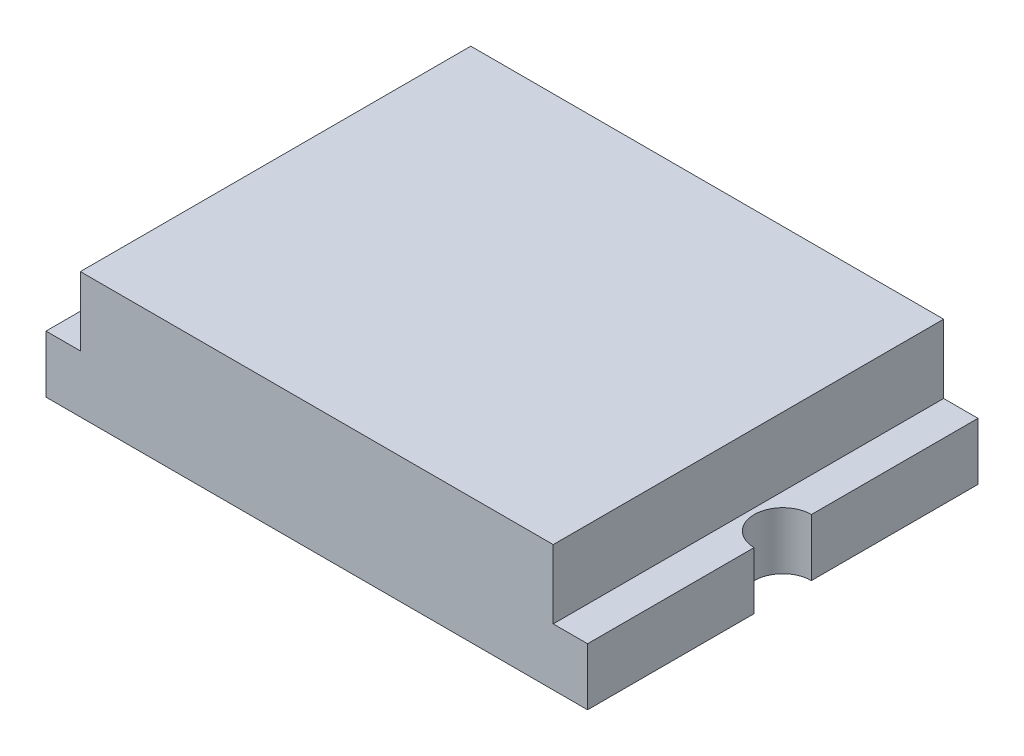
ISO-10303-21;
HEADER;
FILE_DESCRIPTION(('STEP AP214'),'2;1');
FILE_NAME('part.step','',(''),(''),'','','');
FILE_SCHEMA(('AUTOMOTIVE_DESIGN { 1 0 10303 214 1 1 1 1 }'));
ENDSEC;
DATA;
#1=APPLICATION_CONTEXT('core data for automotive mechanical design processes');
#2=APPLICATION_PROTOCOL_DEFINITION('international standard','automotive_design',2000,#1);
#3=PRODUCT_CONTEXT('',#1,'mechanical');
#4=PRODUCT('Part','Part','',(#3));
#5=PRODUCT_RELATED_PRODUCT_CATEGORY('part','',(#4));
#6=PRODUCT_DEFINITION_FORMATION('','',#4);
#7=PRODUCT_DEFINITION_CONTEXT('part definition',#1,'design');
#8=PRODUCT_DEFINITION('design','',#6,#7);
#9=PRODUCT_DEFINITION_SHAPE('','',#8);
#10=(LENGTH_UNIT() NAMED_UNIT(*) SI_UNIT(.MILLI.,.METRE.));
#11=(NAMED_UNIT(*) PLANE_ANGLE_UNIT() SI_UNIT($,.RADIAN.));
#12=(NAMED_UNIT(*) SI_UNIT($,.STERADIAN.) SOLID_ANGLE_UNIT());
#13=UNCERTAINTY_MEASURE_WITH_UNIT(LENGTH_MEASURE(1.E-05),#10,'distance_accuracy_value','');
#14=(GEOMETRIC_REPRESENTATION_CONTEXT(3) GLOBAL_UNCERTAINTY_ASSIGNED_CONTEXT((#13)) GLOBAL_UNIT_ASSIGNED_CONTEXT((#10,
#11,#12)) REPRESENTATION_CONTEXT('',''));
#15=CARTESIAN_POINT('',(0.,0.,0.));
#16=DIRECTION('',(0.,0.,1.));
#17=DIRECTION('',(1.,0.,0.));
#18=AXIS2_PLACEMENT_3D('',#15,#16,#17);
#19=CARTESIAN_POINT('',(-2.065,1.1,-1.705));
#20=DIRECTION('',(1.,0.,0.));
#21=DIRECTION('',(0.,0.,-1.));
#22=AXIS2_PLACEMENT_3D('',#19,#20,#21);
#23=PLANE('',#22);
#24=DIRECTION('',(0.,0.,-1.));
#25=VECTOR('',#24,1.);
#26=CARTESIAN_POINT('',(-2.065,0.5,1.705));
#27=LINE('',#26,#25);
#28=CARTESIAN_POINT('',(-2.065,0.5,1.705));
#29=VERTEX_POINT('',#28);
#30=CARTESIAN_POINT('',(-2.065,0.5,-1.705));
#31=VERTEX_POINT('',#30);
#32=EDGE_CURVE('E59',#29,#31,#27,.T.);
#33=ORIENTED_EDGE('',*,*,#32,.F.);
#34=DIRECTION('',(0.,-1.,0.));
#35=VECTOR('',#34,1.);
#36=CARTESIAN_POINT('',(-2.065,1.1,1.705));
#37=LINE('',#36,#35);
#38=CARTESIAN_POINT('',(-2.065,1.1,1.705));
#39=VERTEX_POINT('',#38);
#40=EDGE_CURVE('E252',#39,#29,#37,.T.);
#41=ORIENTED_EDGE('',*,*,#40,.F.);
#42=DIRECTION('',(0.,0.,1.));
#43=VECTOR('',#42,1.);
#44=CARTESIAN_POINT('',(-2.065,1.1,-1.705));
#45=LINE('',#44,#43);
#46=CARTESIAN_POINT('',(-2.065,1.1,-1.705));
#47=VERTEX_POINT('',#46);
#48=EDGE_CURVE('E261',#47,#39,#45,.T.);
#49=ORIENTED_EDGE('',*,*,#48,.F.);
#50=DIRECTION('',(0.,-1.,0.));
#51=VECTOR('',#50,1.);
#52=CARTESIAN_POINT('',(-2.065,1.1,-1.705));
#53=LINE('',#52,#51);
#54=EDGE_CURVE('E250',#47,#31,#53,.T.);
#55=ORIENTED_EDGE('',*,*,#54,.T.);
#56=EDGE_LOOP('',(#33,#41,#49,#55));
#57=FACE_BOUND('',#56,.T.);
#58=ADVANCED_FACE('F43',(#57),#23,.F.);
#59=CARTESIAN_POINT('',(2.365,0.5,-0.25));
#60=DIRECTION('',(-1.,0.,0.));
#61=DIRECTION('',(0.,0.,1.));
#62=AXIS2_PLACEMENT_3D('',#59,#60,#61);
#63=PLANE('',#62);
#64=DIRECTION('',(0.,0.,-1.));
#65=VECTOR('',#64,1.);
#66=CARTESIAN_POINT('',(2.365,0.,-0.25));
#67=LINE('',#66,#65);
#68=CARTESIAN_POINT('',(2.365,0.,-0.25));
#69=VERTEX_POINT('',#68);
#70=CARTESIAN_POINT('',(2.365,0.,-1.705));
#71=VERTEX_POINT('',#70);
#72=EDGE_CURVE('E136',#69,#71,#67,.T.);
#73=ORIENTED_EDGE('',*,*,#72,.T.);
#74=DIRECTION('',(0.,-1.,0.));
#75=VECTOR('',#74,1.);
#76=CARTESIAN_POINT('',(2.365,0.5,-1.705));
#77=LINE('',#76,#75);
#78=CARTESIAN_POINT('',(2.365,0.5,-1.705));
#79=VERTEX_POINT('',#78);
#80=EDGE_CURVE('E11',#79,#71,#77,.T.);
#81=ORIENTED_EDGE('',*,*,#80,.F.);
#82=DIRECTION('',(0.,0.,-1.));
#83=VECTOR('',#82,1.);
#84=CARTESIAN_POINT('',(2.365,0.5,-0.25));
#85=LINE('',#84,#83);
#86=CARTESIAN_POINT('',(2.365,0.5,-0.25));
#87=VERTEX_POINT('',#86);
#88=EDGE_CURVE('E152',#87,#79,#85,.T.);
#89=ORIENTED_EDGE('',*,*,#88,.F.);
#90=DIRECTION('',(0.,-1.,0.));
#91=VECTOR('',#90,1.);
#92=CARTESIAN_POINT('',(2.365,0.5,-0.25));
#93=LINE('',#92,#91);
#94=EDGE_CURVE('E132',#87,#69,#93,.T.);
#95=ORIENTED_EDGE('',*,*,#94,.T.);
#96=EDGE_LOOP('',(#73,#81,#89,#95));
#97=FACE_BOUND('',#96,.T.);
#98=ADVANCED_FACE('F45',(#97),#63,.F.);
#99=CARTESIAN_POINT('',(2.065,0.5,-1.705));
#100=DIRECTION('',(0.,0.,1.));
#101=DIRECTION('',(1.,0.,0.));
#102=AXIS2_PLACEMENT_3D('',#99,#100,#101);
#103=PLANE('',#102);
#104=DIRECTION('',(-1.,0.,0.));
#105=VECTOR('',#104,1.);
#106=CARTESIAN_POINT('',(2.065,0.,-1.705));
#107=LINE('',#106,#105);
#108=CARTESIAN_POINT('',(-2.365,0.,-1.705));
#109=VERTEX_POINT('',#108);
#110=EDGE_CURVE('E140',#71,#109,#107,.T.);
#111=ORIENTED_EDGE('',*,*,#110,.T.);
#112=DIRECTION('',(0.,-1.,0.));
#113=VECTOR('',#112,1.);
#114=CARTESIAN_POINT('',(-2.365,0.5,-1.705));
#115=LINE('',#114,#113);
#116=CARTESIAN_POINT('',(-2.365,0.5,-1.705));
#117=VERTEX_POINT('',#116);
#118=EDGE_CURVE('E181',#117,#109,#115,.T.);
#119=ORIENTED_EDGE('',*,*,#118,.F.);
#120=DIRECTION('',(-1.,0.,0.));
#121=VECTOR('',#120,1.);
#122=CARTESIAN_POINT('',(-2.365,0.5,-1.705));
#123=LINE('',#122,#121);
#124=EDGE_CURVE('E207',#31,#117,#123,.T.);
#125=ORIENTED_EDGE('',*,*,#124,.F.);
#126=ORIENTED_EDGE('',*,*,#54,.F.);
#127=DIRECTION('',(-1.,0.,0.));
#128=VECTOR('',#127,1.);
#129=CARTESIAN_POINT('',(-2.065,1.1,-1.705));
#130=LINE('',#129,#128);
#131=CARTESIAN_POINT('',(2.065,1.1,-1.705));
#132=VERTEX_POINT('',#131);
#133=EDGE_CURVE('E265',#132,#47,#130,.T.);
#134=ORIENTED_EDGE('',*,*,#133,.F.);
#135=DIRECTION('',(0.,-1.,0.));
#136=VECTOR('',#135,1.);
#137=CARTESIAN_POINT('',(2.065,1.1,-1.705));
#138=LINE('',#137,#136);
#139=CARTESIAN_POINT('',(2.065,0.5,-1.705));
#140=VERTEX_POINT('',#139);
#141=EDGE_CURVE('E141',#132,#140,#138,.T.);
#142=ORIENTED_EDGE('',*,*,#141,.T.);
#143=DIRECTION('',(-1.,0.,0.));
#144=VECTOR('',#143,1.);
#145=CARTESIAN_POINT('',(2.065,0.5,-1.705));
#146=LINE('',#145,#144);
#147=EDGE_CURVE('E97',#79,#140,#146,.T.);
#148=ORIENTED_EDGE('',*,*,#147,.F.);
#149=ORIENTED_EDGE('',*,*,#80,.T.);
#150=EDGE_LOOP('',(#111,#119,#125,#126,#134,#142,#148,#149));
#151=FACE_BOUND('',#150,.T.);
#152=ADVANCED_FACE('F308',(#151),#103,.F.);
#153=CARTESIAN_POINT('',(2.065,0.5,1.705));
#154=DIRECTION('',(0.,0.,-1.));
#155=DIRECTION('',(-1.,0.,0.));
#156=AXIS2_PLACEMENT_3D('',#153,#154,#155);
#157=PLANE('',#156);
#158=DIRECTION('',(1.,0.,0.));
#159=VECTOR('',#158,1.);
#160=CARTESIAN_POINT('',(2.065,0.,1.705));
#161=LINE('',#160,#159);
#162=CARTESIAN_POINT('',(-2.365,0.,1.705));
#163=VERTEX_POINT('',#162);
#164=CARTESIAN_POINT('',(2.365,0.,1.705));
#165=VERTEX_POINT('',#164);
#166=EDGE_CURVE('E121',#163,#165,#161,.T.);
#167=ORIENTED_EDGE('',*,*,#166,.T.);
#168=DIRECTION('',(0.,-1.,0.));
#169=VECTOR('',#168,1.);
#170=CARTESIAN_POINT('',(2.365,0.5,1.705));
#171=LINE('',#170,#169);
#172=CARTESIAN_POINT('',(2.365,0.5,1.705));
#173=VERTEX_POINT('',#172);
#174=EDGE_CURVE('E52',#173,#165,#171,.T.);
#175=ORIENTED_EDGE('',*,*,#174,.F.);
#176=DIRECTION('',(1.,0.,0.));
#177=VECTOR('',#176,1.);
#178=CARTESIAN_POINT('',(2.065,0.5,1.705));
#179=LINE('',#178,#177);
#180=CARTESIAN_POINT('',(2.065,0.5,1.705));
#181=VERTEX_POINT('',#180);
#182=EDGE_CURVE('E105',#181,#173,#179,.T.);
#183=ORIENTED_EDGE('',*,*,#182,.F.);
#184=DIRECTION('',(0.,-1.,0.));
#185=VECTOR('',#184,1.);
#186=CARTESIAN_POINT('',(2.065,1.1,1.705));
#187=LINE('',#186,#185);
#188=CARTESIAN_POINT('',(2.065,1.1,1.705));
#189=VERTEX_POINT('',#188);
#190=EDGE_CURVE('E254',#189,#181,#187,.T.);
#191=ORIENTED_EDGE('',*,*,#190,.F.);
#192=DIRECTION('',(1.,0.,0.));
#193=VECTOR('',#192,1.);
#194=CARTESIAN_POINT('',(-2.065,1.1,1.705));
#195=LINE('',#194,#193);
#196=EDGE_CURVE('E257',#39,#189,#195,.T.);
#197=ORIENTED_EDGE('',*,*,#196,.F.);
#198=ORIENTED_EDGE('',*,*,#40,.T.);
#199=DIRECTION('',(1.,0.,0.));
#200=VECTOR('',#199,1.);
#201=CARTESIAN_POINT('',(-2.365,0.5,1.705));
#202=LINE('',#201,#200);
#203=CARTESIAN_POINT('',(-2.365,0.5,1.705));
#204=VERTEX_POINT('',#203);
#205=EDGE_CURVE('E215',#204,#29,#202,.T.);
#206=ORIENTED_EDGE('',*,*,#205,.F.);
#207=DIRECTION('',(0.,-1.,0.));
#208=VECTOR('',#207,1.);
#209=CARTESIAN_POINT('',(-2.365,0.5,1.705));
#210=LINE('',#209,#208);
#211=EDGE_CURVE('E184',#204,#163,#210,.T.);
#212=ORIENTED_EDGE('',*,*,#211,.T.);
#213=EDGE_LOOP('',(#167,#175,#183,#191,#197,#198,#206,#212));
#214=FACE_BOUND('',#213,.T.);
#215=ADVANCED_FACE('F118',(#214),#157,.F.);
#216=CARTESIAN_POINT('',(2.365,0.5,1.705));
#217=DIRECTION('',(-1.,0.,0.));
#218=DIRECTION('',(0.,0.,1.));
#219=AXIS2_PLACEMENT_3D('',#216,#217,#218);
#220=PLANE('',#219);
#221=DIRECTION('',(0.,0.,-1.));
#222=VECTOR('',#221,1.);
#223=CARTESIAN_POINT('',(2.365,0.,1.705));
#224=LINE('',#223,#222);
#225=CARTESIAN_POINT('',(2.365,0.,0.25));
#226=VERTEX_POINT('',#225);
#227=EDGE_CURVE('E147',#165,#226,#224,.T.);
#228=ORIENTED_EDGE('',*,*,#227,.T.);
#229=DIRECTION('',(0.,-1.,0.));
#230=VECTOR('',#229,1.);
#231=CARTESIAN_POINT('',(2.365,0.5,0.25));
#232=LINE('',#231,#230);
#233=CARTESIAN_POINT('',(2.365,0.5,0.25));
#234=VERTEX_POINT('',#233);
#235=EDGE_CURVE('E125',#234,#226,#232,.T.);
#236=ORIENTED_EDGE('',*,*,#235,.F.);
#237=DIRECTION('',(0.,0.,-1.));
#238=VECTOR('',#237,1.);
#239=CARTESIAN_POINT('',(2.365,0.5,1.705));
#240=LINE('',#239,#238);
#241=EDGE_CURVE('E109',#173,#234,#240,.T.);
#242=ORIENTED_EDGE('',*,*,#241,.F.);
#243=ORIENTED_EDGE('',*,*,#174,.T.);
#244=EDGE_LOOP('',(#228,#236,#242,#243));
#245=FACE_BOUND('',#244,.T.);
#246=ADVANCED_FACE('F126',(#245),#220,.F.);
#247=CARTESIAN_POINT('',(2.365,0.5,0.));
#248=DIRECTION('',(0.,-1.,0.));
#249=DIRECTION('',(0.,0.,-1.));
#250=AXIS2_PLACEMENT_3D('',#247,#248,#249);
#251=CYLINDRICAL_SURFACE('',#250,0.25);
#252=CARTESIAN_POINT('',(2.365,0.,0.));
#253=DIRECTION('',(0.,-1.,0.));
#254=DIRECTION('',(0.,0.,1.));
#255=AXIS2_PLACEMENT_3D('',#252,#253,#254);
#256=CIRCLE('',#255,0.25);
#257=EDGE_CURVE('E89',#226,#69,#256,.T.);
#258=ORIENTED_EDGE('',*,*,#257,.T.);
#259=ORIENTED_EDGE('',*,*,#94,.F.);
#260=CARTESIAN_POINT('',(2.365,0.5,0.));
#261=DIRECTION('',(0.,-1.,0.));
#262=DIRECTION('',(0.,0.,1.));
#263=AXIS2_PLACEMENT_3D('',#260,#261,#262);
#264=CIRCLE('',#263,0.25);
#265=EDGE_CURVE('E68',#234,#87,#264,.T.);
#266=ORIENTED_EDGE('',*,*,#265,.F.);
#267=ORIENTED_EDGE('',*,*,#235,.T.);
#268=EDGE_LOOP('',(#258,#259,#266,#267));
#269=FACE_BOUND('',#268,.T.);
#270=ADVANCED_FACE('F158',(#269),#251,.F.);
#271=CARTESIAN_POINT('',(2.365,0.5,0.));
#272=DIRECTION('',(0.,1.,0.));
#273=DIRECTION('',(0.,0.,1.));
#274=AXIS2_PLACEMENT_3D('',#271,#272,#273);
#275=PLANE('',#274);
#276=ORIENTED_EDGE('',*,*,#88,.T.);
#277=ORIENTED_EDGE('',*,*,#147,.T.);
#278=DIRECTION('',(0.,0.,1.));
#279=VECTOR('',#278,1.);
#280=CARTESIAN_POINT('',(2.065,0.5,1.705));
#281=LINE('',#280,#279);
#282=EDGE_CURVE('E112',#140,#181,#281,.T.);
#283=ORIENTED_EDGE('',*,*,#282,.T.);
#284=ORIENTED_EDGE('',*,*,#182,.T.);
#285=ORIENTED_EDGE('',*,*,#241,.T.);
#286=ORIENTED_EDGE('',*,*,#265,.T.);
#287=EDGE_LOOP('',(#276,#277,#283,#284,#285,#286));
#288=FACE_BOUND('',#287,.T.);
#289=ADVANCED_FACE('F107',(#288),#275,.T.);
#290=CARTESIAN_POINT('',(2.365,0.,0.));
#291=DIRECTION('',(0.,1.,0.));
#292=DIRECTION('',(0.,0.,1.));
#293=AXIS2_PLACEMENT_3D('',#290,#291,#292);
#294=PLANE('',#293);
#295=ORIENTED_EDGE('',*,*,#72,.F.);
#296=ORIENTED_EDGE('',*,*,#257,.F.);
#297=ORIENTED_EDGE('',*,*,#227,.F.);
#298=ORIENTED_EDGE('',*,*,#166,.F.);
#299=DIRECTION('',(0.,0.,1.));
#300=VECTOR('',#299,1.);
#301=CARTESIAN_POINT('',(-2.365,0.,1.705));
#302=LINE('',#301,#300);
#303=CARTESIAN_POINT('',(-2.365,0.,0.25));
#304=VERTEX_POINT('',#303);
#305=EDGE_CURVE('E240',#304,#163,#302,.T.);
#306=ORIENTED_EDGE('',*,*,#305,.F.);
#307=CARTESIAN_POINT('',(-2.365,0.,0.));
#308=DIRECTION('',(0.,-1.,0.));
#309=DIRECTION('',(0.,0.,1.));
#310=AXIS2_PLACEMENT_3D('',#307,#308,#309);
#311=CIRCLE('',#310,0.25);
#312=CARTESIAN_POINT('',(-2.365,0.,-0.25));
#313=VERTEX_POINT('',#312);
#314=EDGE_CURVE('E226',#313,#304,#311,.T.);
#315=ORIENTED_EDGE('',*,*,#314,.F.);
#316=DIRECTION('',(0.,0.,1.));
#317=VECTOR('',#316,1.);
#318=CARTESIAN_POINT('',(-2.365,0.,-0.25));
#319=LINE('',#318,#317);
#320=EDGE_CURVE('E233',#109,#313,#319,.T.);
#321=ORIENTED_EDGE('',*,*,#320,.F.);
#322=ORIENTED_EDGE('',*,*,#110,.F.);
#323=EDGE_LOOP('',(#295,#296,#297,#298,#306,#315,#321,#322));
#324=FACE_BOUND('',#323,.T.);
#325=ADVANCED_FACE('F161',(#324),#294,.F.);
#326=CARTESIAN_POINT('',(2.065,1.1,-1.705));
#327=DIRECTION('',(-1.,0.,0.));
#328=DIRECTION('',(0.,0.,1.));
#329=AXIS2_PLACEMENT_3D('',#326,#327,#328);
#330=PLANE('',#329);
#331=ORIENTED_EDGE('',*,*,#282,.F.);
#332=ORIENTED_EDGE('',*,*,#141,.F.);
#333=DIRECTION('',(0.,0.,-1.));
#334=VECTOR('',#333,1.);
#335=CARTESIAN_POINT('',(2.065,1.1,-1.705));
#336=LINE('',#335,#334);
#337=EDGE_CURVE('E268',#189,#132,#336,.T.);
#338=ORIENTED_EDGE('',*,*,#337,.F.);
#339=ORIENTED_EDGE('',*,*,#190,.T.);
#340=EDGE_LOOP('',(#331,#332,#338,#339));
#341=FACE_BOUND('',#340,.T.);
#342=ADVANCED_FACE('F307',(#341),#330,.F.);
#343=CARTESIAN_POINT('',(0.,1.1,0.));
#344=DIRECTION('',(0.,1.,0.));
#345=DIRECTION('',(0.,0.,1.));
#346=AXIS2_PLACEMENT_3D('',#343,#344,#345);
#347=PLANE('',#346);
#348=ORIENTED_EDGE('',*,*,#337,.T.);
#349=ORIENTED_EDGE('',*,*,#133,.T.);
#350=ORIENTED_EDGE('',*,*,#48,.T.);
#351=ORIENTED_EDGE('',*,*,#196,.T.);
#352=EDGE_LOOP('',(#348,#349,#350,#351));
#353=FACE_BOUND('',#352,.T.);
#354=ADVANCED_FACE('F312',(#353),#347,.T.);
#355=CARTESIAN_POINT('',(-2.365,0.5,1.705));
#356=DIRECTION('',(1.,0.,0.));
#357=DIRECTION('',(0.,0.,-1.));
#358=AXIS2_PLACEMENT_3D('',#355,#356,#357);
#359=PLANE('',#358);
#360=ORIENTED_EDGE('',*,*,#305,.T.);
#361=ORIENTED_EDGE('',*,*,#211,.F.);
#362=DIRECTION('',(0.,0.,1.));
#363=VECTOR('',#362,1.);
#364=CARTESIAN_POINT('',(-2.365,0.5,1.705));
#365=LINE('',#364,#363);
#366=CARTESIAN_POINT('',(-2.365,0.5,0.25));
#367=VERTEX_POINT('',#366);
#368=EDGE_CURVE('E220',#367,#204,#365,.T.);
#369=ORIENTED_EDGE('',*,*,#368,.F.);
#370=DIRECTION('',(0.,-1.,0.));
#371=VECTOR('',#370,1.);
#372=CARTESIAN_POINT('',(-2.365,0.5,0.25));
#373=LINE('',#372,#371);
#374=EDGE_CURVE('E194',#367,#304,#373,.T.);
#375=ORIENTED_EDGE('',*,*,#374,.T.);
#376=EDGE_LOOP('',(#360,#361,#369,#375));
#377=FACE_BOUND('',#376,.T.);
#378=ADVANCED_FACE('F286',(#377),#359,.F.);
#379=CARTESIAN_POINT('',(-2.365,0.5,-0.25));
#380=DIRECTION('',(1.,0.,0.));
#381=DIRECTION('',(0.,0.,-1.));
#382=AXIS2_PLACEMENT_3D('',#379,#380,#381);
#383=PLANE('',#382);
#384=ORIENTED_EDGE('',*,*,#320,.T.);
#385=DIRECTION('',(0.,-1.,0.));
#386=VECTOR('',#385,1.);
#387=CARTESIAN_POINT('',(-2.365,0.5,-0.25));
#388=LINE('',#387,#386);
#389=CARTESIAN_POINT('',(-2.365,0.5,-0.25));
#390=VERTEX_POINT('',#389);
#391=EDGE_CURVE('E185',#390,#313,#388,.T.);
#392=ORIENTED_EDGE('',*,*,#391,.F.);
#393=DIRECTION('',(0.,0.,1.));
#394=VECTOR('',#393,1.);
#395=CARTESIAN_POINT('',(-2.365,0.5,-0.25));
#396=LINE('',#395,#394);
#397=EDGE_CURVE('E179',#117,#390,#396,.T.);
#398=ORIENTED_EDGE('',*,*,#397,.F.);
#399=ORIENTED_EDGE('',*,*,#118,.T.);
#400=EDGE_LOOP('',(#384,#392,#398,#399));
#401=FACE_BOUND('',#400,.T.);
#402=ADVANCED_FACE('F324',(#401),#383,.F.);
#403=CARTESIAN_POINT('',(-2.365,0.5,0.));
#404=DIRECTION('',(0.,-1.,0.));
#405=DIRECTION('',(0.,0.,-1.));
#406=AXIS2_PLACEMENT_3D('',#403,#404,#405);
#407=CYLINDRICAL_SURFACE('',#406,0.25);
#408=ORIENTED_EDGE('',*,*,#314,.T.);
#409=ORIENTED_EDGE('',*,*,#374,.F.);
#410=CARTESIAN_POINT('',(-2.365,0.5,0.));
#411=DIRECTION('',(0.,-1.,0.));
#412=DIRECTION('',(0.,0.,1.));
#413=AXIS2_PLACEMENT_3D('',#410,#411,#412);
#414=CIRCLE('',#413,0.25);
#415=EDGE_CURVE('E200',#390,#367,#414,.T.);
#416=ORIENTED_EDGE('',*,*,#415,.F.);
#417=ORIENTED_EDGE('',*,*,#391,.T.);
#418=EDGE_LOOP('',(#408,#409,#416,#417));
#419=FACE_BOUND('',#418,.T.);
#420=ADVANCED_FACE('F327',(#419),#407,.F.);
#421=CARTESIAN_POINT('',(-2.365,0.5,0.));
#422=DIRECTION('',(0.,1.,0.));
#423=DIRECTION('',(0.,0.,1.));
#424=AXIS2_PLACEMENT_3D('',#421,#422,#423);
#425=PLANE('',#424);
#426=ORIENTED_EDGE('',*,*,#368,.T.);
#427=ORIENTED_EDGE('',*,*,#205,.T.);
#428=ORIENTED_EDGE('',*,*,#32,.T.);
#429=ORIENTED_EDGE('',*,*,#124,.T.);
#430=ORIENTED_EDGE('',*,*,#397,.T.);
#431=ORIENTED_EDGE('',*,*,#415,.T.);
#432=EDGE_LOOP('',(#426,#427,#428,#429,#430,#431));
#433=FACE_BOUND('',#432,.T.);
#434=ADVANCED_FACE('F314',(#433),#425,.T.);
#435=CLOSED_SHELL('',(#58,#98,#152,#215,#246,#270,#289,#325,#342,#354,#378,#402,#420,#434));
#436=MANIFOLD_SOLID_BREP('B2',#435);
#437=ADVANCED_BREP_SHAPE_REPRESENTATION('',(#18,#436),#14);
#438=SHAPE_DEFINITION_REPRESENTATION(#9,#437);
ENDSEC;
END-ISO-10303-21;
